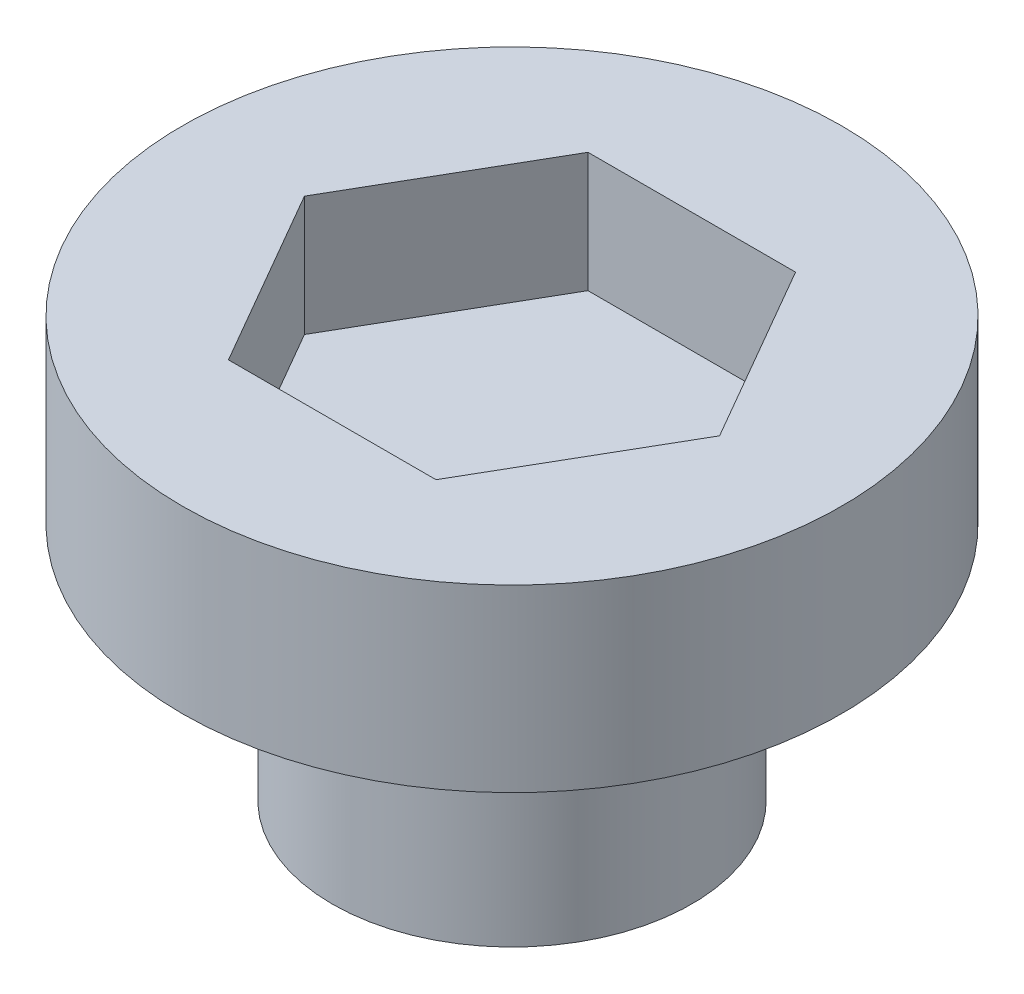
ISO-10303-21;
HEADER;
FILE_DESCRIPTION(('STEP AP214'),'2;1');
FILE_NAME('part.step','',(''),(''),'','','');
FILE_SCHEMA(('AUTOMOTIVE_DESIGN { 1 0 10303 214 1 1 1 1 }'));
ENDSEC;
DATA;
#1=APPLICATION_CONTEXT('core data for automotive mechanical design processes');
#2=APPLICATION_PROTOCOL_DEFINITION('international standard','automotive_design',2000,#1);
#3=PRODUCT_CONTEXT('',#1,'mechanical');
#4=PRODUCT('Part','Part','',(#3));
#5=PRODUCT_RELATED_PRODUCT_CATEGORY('part','',(#4));
#6=PRODUCT_DEFINITION_FORMATION('','',#4);
#7=PRODUCT_DEFINITION_CONTEXT('part definition',#1,'design');
#8=PRODUCT_DEFINITION('design','',#6,#7);
#9=PRODUCT_DEFINITION_SHAPE('','',#8);
#10=(LENGTH_UNIT() NAMED_UNIT(*) SI_UNIT(.MILLI.,.METRE.));
#11=(NAMED_UNIT(*) PLANE_ANGLE_UNIT() SI_UNIT($,.RADIAN.));
#12=(NAMED_UNIT(*) SI_UNIT($,.STERADIAN.) SOLID_ANGLE_UNIT());
#13=UNCERTAINTY_MEASURE_WITH_UNIT(LENGTH_MEASURE(1.E-05),#10,'distance_accuracy_value','');
#14=(GEOMETRIC_REPRESENTATION_CONTEXT(3) GLOBAL_UNCERTAINTY_ASSIGNED_CONTEXT((#13)) GLOBAL_UNIT_ASSIGNED_CONTEXT((#10,
#11,#12)) REPRESENTATION_CONTEXT('',''));
#15=CARTESIAN_POINT('',(0.,0.,0.));
#16=DIRECTION('',(0.,0.,1.));
#17=DIRECTION('',(1.,0.,0.));
#18=AXIS2_PLACEMENT_3D('',#15,#16,#17);
#19=CARTESIAN_POINT('',(0.,2.,0.));
#20=DIRECTION('',(0.,-1.,0.));
#21=DIRECTION('',(0.,0.,-1.));
#22=AXIS2_PLACEMENT_3D('',#19,#20,#21);
#23=PLANE('',#22);
#24=CARTESIAN_POINT('',(0.,2.,0.));
#25=DIRECTION('',(0.,-1.,0.));
#26=DIRECTION('',(0.,0.,-1.));
#27=AXIS2_PLACEMENT_3D('',#24,#25,#26);
#28=CIRCLE('',#27,2.75);
#29=CARTESIAN_POINT('',(0.,2.,-2.75));
#30=VERTEX_POINT('',#29);
#31=EDGE_CURVE('E11',#30,#30,#28,.T.);
#32=ORIENTED_EDGE('',*,*,#31,.T.);
#33=EDGE_LOOP('',(#32));
#34=FACE_BOUND('',#33,.T.);
#35=CARTESIAN_POINT('',(0.,2.,0.));
#36=DIRECTION('',(0.,-1.,0.));
#37=DIRECTION('',(0.,0.,-1.));
#38=AXIS2_PLACEMENT_3D('',#35,#36,#37);
#39=CIRCLE('',#38,1.5);
#40=CARTESIAN_POINT('',(0.,2.,-1.5));
#41=VERTEX_POINT('',#40);
#42=EDGE_CURVE('E136',#41,#41,#39,.T.);
#43=ORIENTED_EDGE('',*,*,#42,.F.);
#44=EDGE_LOOP('',(#43));
#45=FACE_BOUND('',#44,.T.);
#46=ADVANCED_FACE('F35',(#34,#45),#23,.T.);
#47=CARTESIAN_POINT('',(0.,0.,0.));
#48=DIRECTION('',(0.,-1.,0.));
#49=DIRECTION('',(0.,0.,-1.));
#50=AXIS2_PLACEMENT_3D('',#47,#48,#49);
#51=CYLINDRICAL_SURFACE('',#50,2.75);
#52=CARTESIAN_POINT('',(0.,3.5,0.));
#53=DIRECTION('',(0.,-1.,0.));
#54=DIRECTION('',(0.,0.,-1.));
#55=AXIS2_PLACEMENT_3D('',#52,#53,#54);
#56=CIRCLE('',#55,2.75);
#57=CARTESIAN_POINT('',(0.,3.5,-2.75));
#58=VERTEX_POINT('',#57);
#59=EDGE_CURVE('E42',#58,#58,#56,.T.);
#60=ORIENTED_EDGE('',*,*,#59,.T.);
#61=EDGE_LOOP('',(#60));
#62=FACE_BOUND('',#61,.T.);
#63=ORIENTED_EDGE('',*,*,#31,.F.);
#64=EDGE_LOOP('',(#63));
#65=FACE_BOUND('',#64,.T.);
#66=ADVANCED_FACE('F149',(#62,#65),#51,.T.);
#67=CARTESIAN_POINT('',(0.,3.5,0.));
#68=DIRECTION('',(0.,-1.,0.));
#69=DIRECTION('',(0.,0.,-1.));
#70=AXIS2_PLACEMENT_3D('',#67,#68,#69);
#71=PLANE('',#70);
#72=DIRECTION('',(-0.5,0.,0.866025403784439));
#73=VECTOR('',#72,1.);
#74=CARTESIAN_POINT('',(-0.866025403784438,3.5,-1.5));
#75=LINE('',#74,#73);
#76=CARTESIAN_POINT('',(-0.866025403784438,3.5,-1.5));
#77=VERTEX_POINT('',#76);
#78=CARTESIAN_POINT('',(-1.73205080756888,3.5,0.));
#79=VERTEX_POINT('',#78);
#80=EDGE_CURVE('E123',#77,#79,#75,.T.);
#81=ORIENTED_EDGE('',*,*,#80,.F.);
#82=DIRECTION('',(-1.,0.,0.));
#83=VECTOR('',#82,1.);
#84=CARTESIAN_POINT('',(0.86602540378444,3.5,-1.5));
#85=LINE('',#84,#83);
#86=CARTESIAN_POINT('',(0.86602540378444,3.5,-1.5));
#87=VERTEX_POINT('',#86);
#88=EDGE_CURVE('E49',#87,#77,#85,.T.);
#89=ORIENTED_EDGE('',*,*,#88,.F.);
#90=DIRECTION('',(-0.5,0.,-0.866025403784439));
#91=VECTOR('',#90,1.);
#92=CARTESIAN_POINT('',(1.73205080756888,3.5,0.));
#93=LINE('',#92,#91);
#94=CARTESIAN_POINT('',(1.73205080756888,3.5,0.));
#95=VERTEX_POINT('',#94);
#96=EDGE_CURVE('E132',#95,#87,#93,.T.);
#97=ORIENTED_EDGE('',*,*,#96,.F.);
#98=DIRECTION('',(0.5,0.,-0.866025403784439));
#99=VECTOR('',#98,1.);
#100=CARTESIAN_POINT('',(0.866025403784438,3.5,1.5));
#101=LINE('',#100,#99);
#102=CARTESIAN_POINT('',(0.866025403784438,3.5,1.5));
#103=VERTEX_POINT('',#102);
#104=EDGE_CURVE('E130',#103,#95,#101,.T.);
#105=ORIENTED_EDGE('',*,*,#104,.F.);
#106=DIRECTION('',(1.,0.,0.));
#107=VECTOR('',#106,1.);
#108=CARTESIAN_POINT('',(-0.866025403784439,3.5,1.5));
#109=LINE('',#108,#107);
#110=CARTESIAN_POINT('',(-0.866025403784439,3.5,1.5));
#111=VERTEX_POINT('',#110);
#112=EDGE_CURVE('E97',#111,#103,#109,.T.);
#113=ORIENTED_EDGE('',*,*,#112,.F.);
#114=DIRECTION('',(0.5,0.,0.866025403784439));
#115=VECTOR('',#114,1.);
#116=CARTESIAN_POINT('',(-1.73205080756888,3.5,0.));
#117=LINE('',#116,#115);
#118=EDGE_CURVE('E126',#79,#111,#117,.T.);
#119=ORIENTED_EDGE('',*,*,#118,.F.);
#120=EDGE_LOOP('',(#81,#89,#97,#105,#113,#119));
#121=FACE_BOUND('',#120,.T.);
#122=ORIENTED_EDGE('',*,*,#59,.F.);
#123=EDGE_LOOP('',(#122));
#124=FACE_BOUND('',#123,.T.);
#125=ADVANCED_FACE('F152',(#121,#124),#71,.F.);
#126=CARTESIAN_POINT('',(0.,0.,0.));
#127=DIRECTION('',(0.,-1.,0.));
#128=DIRECTION('',(0.,0.,-1.));
#129=AXIS2_PLACEMENT_3D('',#126,#127,#128);
#130=PLANE('',#129);
#131=CARTESIAN_POINT('',(0.,0.,0.));
#132=DIRECTION('',(0.,-1.,0.));
#133=DIRECTION('',(0.,0.,-1.));
#134=AXIS2_PLACEMENT_3D('',#131,#132,#133);
#135=CIRCLE('',#134,1.5);
#136=CARTESIAN_POINT('',(0.,0.,-1.5));
#137=VERTEX_POINT('',#136);
#138=EDGE_CURVE('E144',#137,#137,#135,.T.);
#139=ORIENTED_EDGE('',*,*,#138,.T.);
#140=EDGE_LOOP('',(#139));
#141=FACE_BOUND('',#140,.T.);
#142=ADVANCED_FACE('F154',(#141),#130,.T.);
#143=CARTESIAN_POINT('',(0.,0.,0.));
#144=DIRECTION('',(0.,-1.,0.));
#145=DIRECTION('',(0.,0.,-1.));
#146=AXIS2_PLACEMENT_3D('',#143,#144,#145);
#147=CYLINDRICAL_SURFACE('',#146,1.5);
#148=ORIENTED_EDGE('',*,*,#42,.T.);
#149=EDGE_LOOP('',(#148));
#150=FACE_BOUND('',#149,.T.);
#151=ORIENTED_EDGE('',*,*,#138,.F.);
#152=EDGE_LOOP('',(#151));
#153=FACE_BOUND('',#152,.T.);
#154=ADVANCED_FACE('F161',(#150,#153),#147,.T.);
#155=CARTESIAN_POINT('',(0.86602540378444,2.5,-1.5));
#156=DIRECTION('',(0.,0.,-1.));
#157=DIRECTION('',(-1.,0.,0.));
#158=AXIS2_PLACEMENT_3D('',#155,#156,#157);
#159=PLANE('',#158);
#160=ORIENTED_EDGE('',*,*,#88,.T.);
#161=DIRECTION('',(0.,1.,0.));
#162=VECTOR('',#161,1.);
#163=CARTESIAN_POINT('',(-0.866025403784438,2.5,-1.5));
#164=LINE('',#163,#162);
#165=CARTESIAN_POINT('',(-0.866025403784438,2.5,-1.5));
#166=VERTEX_POINT('',#165);
#167=EDGE_CURVE('E79',#166,#77,#164,.T.);
#168=ORIENTED_EDGE('',*,*,#167,.F.);
#169=DIRECTION('',(-1.,0.,0.));
#170=VECTOR('',#169,1.);
#171=CARTESIAN_POINT('',(0.86602540378444,2.5,-1.5));
#172=LINE('',#171,#170);
#173=CARTESIAN_POINT('',(0.86602540378444,2.5,-1.5));
#174=VERTEX_POINT('',#173);
#175=EDGE_CURVE('E134',#174,#166,#172,.T.);
#176=ORIENTED_EDGE('',*,*,#175,.F.);
#177=DIRECTION('',(0.,1.,0.));
#178=VECTOR('',#177,1.);
#179=CARTESIAN_POINT('',(0.86602540378444,2.5,-1.5));
#180=LINE('',#179,#178);
#181=EDGE_CURVE('E57',#174,#87,#180,.T.);
#182=ORIENTED_EDGE('',*,*,#181,.T.);
#183=EDGE_LOOP('',(#160,#168,#176,#182));
#184=FACE_BOUND('',#183,.T.);
#185=ADVANCED_FACE('F175',(#184),#159,.F.);
#186=CARTESIAN_POINT('',(1.73205080756888,2.5,0.));
#187=DIRECTION('',(0.866025403784439,0.,-0.5));
#188=DIRECTION('',(-0.5,0.,-0.866025403784439));
#189=AXIS2_PLACEMENT_3D('',#186,#187,#188);
#190=PLANE('',#189);
#191=ORIENTED_EDGE('',*,*,#96,.T.);
#192=ORIENTED_EDGE('',*,*,#181,.F.);
#193=DIRECTION('',(-0.5,0.,-0.866025403784439));
#194=VECTOR('',#193,1.);
#195=CARTESIAN_POINT('',(1.73205080756888,2.5,0.));
#196=LINE('',#195,#194);
#197=CARTESIAN_POINT('',(1.73205080756888,2.5,0.));
#198=VERTEX_POINT('',#197);
#199=EDGE_CURVE('E109',#198,#174,#196,.T.);
#200=ORIENTED_EDGE('',*,*,#199,.F.);
#201=DIRECTION('',(0.,1.,0.));
#202=VECTOR('',#201,1.);
#203=CARTESIAN_POINT('',(1.73205080756888,2.5,0.));
#204=LINE('',#203,#202);
#205=EDGE_CURVE('E101',#198,#95,#204,.T.);
#206=ORIENTED_EDGE('',*,*,#205,.T.);
#207=EDGE_LOOP('',(#191,#192,#200,#206));
#208=FACE_BOUND('',#207,.T.);
#209=ADVANCED_FACE('F181',(#208),#190,.F.);
#210=CARTESIAN_POINT('',(0.866025403784438,2.5,1.5));
#211=DIRECTION('',(0.866025403784439,0.,0.5));
#212=DIRECTION('',(0.5,0.,-0.866025403784439));
#213=AXIS2_PLACEMENT_3D('',#210,#211,#212);
#214=PLANE('',#213);
#215=ORIENTED_EDGE('',*,*,#104,.T.);
#216=ORIENTED_EDGE('',*,*,#205,.F.);
#217=DIRECTION('',(0.5,0.,-0.866025403784439));
#218=VECTOR('',#217,1.);
#219=CARTESIAN_POINT('',(0.866025403784438,2.5,1.5));
#220=LINE('',#219,#218);
#221=CARTESIAN_POINT('',(0.866025403784438,2.5,1.5));
#222=VERTEX_POINT('',#221);
#223=EDGE_CURVE('E105',#222,#198,#220,.T.);
#224=ORIENTED_EDGE('',*,*,#223,.F.);
#225=DIRECTION('',(0.,1.,0.));
#226=VECTOR('',#225,1.);
#227=CARTESIAN_POINT('',(0.866025403784438,2.5,1.5));
#228=LINE('',#227,#226);
#229=EDGE_CURVE('E90',#222,#103,#228,.T.);
#230=ORIENTED_EDGE('',*,*,#229,.T.);
#231=EDGE_LOOP('',(#215,#216,#224,#230));
#232=FACE_BOUND('',#231,.T.);
#233=ADVANCED_FACE('F106',(#232),#214,.F.);
#234=CARTESIAN_POINT('',(-0.866025403784439,2.5,1.5));
#235=DIRECTION('',(0.,0.,1.));
#236=DIRECTION('',(1.,0.,0.));
#237=AXIS2_PLACEMENT_3D('',#234,#235,#236);
#238=PLANE('',#237);
#239=ORIENTED_EDGE('',*,*,#112,.T.);
#240=ORIENTED_EDGE('',*,*,#229,.F.);
#241=DIRECTION('',(1.,0.,0.));
#242=VECTOR('',#241,1.);
#243=CARTESIAN_POINT('',(-0.866025403784439,2.5,1.5));
#244=LINE('',#243,#242);
#245=CARTESIAN_POINT('',(-0.866025403784439,2.5,1.5));
#246=VERTEX_POINT('',#245);
#247=EDGE_CURVE('E94',#246,#222,#244,.T.);
#248=ORIENTED_EDGE('',*,*,#247,.F.);
#249=DIRECTION('',(0.,1.,0.));
#250=VECTOR('',#249,1.);
#251=CARTESIAN_POINT('',(-0.866025403784439,2.5,1.5));
#252=LINE('',#251,#250);
#253=EDGE_CURVE('E102',#246,#111,#252,.T.);
#254=ORIENTED_EDGE('',*,*,#253,.T.);
#255=EDGE_LOOP('',(#239,#240,#248,#254));
#256=FACE_BOUND('',#255,.T.);
#257=ADVANCED_FACE('F92',(#256),#238,.F.);
#258=CARTESIAN_POINT('',(-1.73205080756888,2.5,0.));
#259=DIRECTION('',(-0.866025403784439,0.,0.5));
#260=DIRECTION('',(0.5,0.,0.866025403784439));
#261=AXIS2_PLACEMENT_3D('',#258,#259,#260);
#262=PLANE('',#261);
#263=ORIENTED_EDGE('',*,*,#118,.T.);
#264=ORIENTED_EDGE('',*,*,#253,.F.);
#265=DIRECTION('',(0.5,0.,0.866025403784439));
#266=VECTOR('',#265,1.);
#267=CARTESIAN_POINT('',(-1.73205080756888,2.5,0.));
#268=LINE('',#267,#266);
#269=CARTESIAN_POINT('',(-1.73205080756888,2.5,0.));
#270=VERTEX_POINT('',#269);
#271=EDGE_CURVE('E115',#270,#246,#268,.T.);
#272=ORIENTED_EDGE('',*,*,#271,.F.);
#273=DIRECTION('',(0.,1.,0.));
#274=VECTOR('',#273,1.);
#275=CARTESIAN_POINT('',(-1.73205080756888,2.5,0.));
#276=LINE('',#275,#274);
#277=EDGE_CURVE('E139',#270,#79,#276,.T.);
#278=ORIENTED_EDGE('',*,*,#277,.T.);
#279=EDGE_LOOP('',(#263,#264,#272,#278));
#280=FACE_BOUND('',#279,.T.);
#281=ADVANCED_FACE('F187',(#280),#262,.F.);
#282=CARTESIAN_POINT('',(-0.866025403784438,2.5,-1.5));
#283=DIRECTION('',(-0.866025403784439,0.,-0.5));
#284=DIRECTION('',(-0.5,0.,0.866025403784439));
#285=AXIS2_PLACEMENT_3D('',#282,#283,#284);
#286=PLANE('',#285);
#287=ORIENTED_EDGE('',*,*,#80,.T.);
#288=ORIENTED_EDGE('',*,*,#277,.F.);
#289=DIRECTION('',(-0.5,0.,0.866025403784439));
#290=VECTOR('',#289,1.);
#291=CARTESIAN_POINT('',(-0.866025403784438,2.5,-1.5));
#292=LINE('',#291,#290);
#293=EDGE_CURVE('E117',#166,#270,#292,.T.);
#294=ORIENTED_EDGE('',*,*,#293,.F.);
#295=ORIENTED_EDGE('',*,*,#167,.T.);
#296=EDGE_LOOP('',(#287,#288,#294,#295));
#297=FACE_BOUND('',#296,.T.);
#298=ADVANCED_FACE('F184',(#297),#286,.F.);
#299=CARTESIAN_POINT('',(0.,2.5,0.));
#300=DIRECTION('',(0.,1.,0.));
#301=DIRECTION('',(0.,0.,1.));
#302=AXIS2_PLACEMENT_3D('',#299,#300,#301);
#303=PLANE('',#302);
#304=ORIENTED_EDGE('',*,*,#175,.T.);
#305=ORIENTED_EDGE('',*,*,#293,.T.);
#306=ORIENTED_EDGE('',*,*,#271,.T.);
#307=ORIENTED_EDGE('',*,*,#247,.T.);
#308=ORIENTED_EDGE('',*,*,#223,.T.);
#309=ORIENTED_EDGE('',*,*,#199,.T.);
#310=EDGE_LOOP('',(#304,#305,#306,#307,#308,#309));
#311=FACE_BOUND('',#310,.T.);
#312=ADVANCED_FACE('F112',(#311),#303,.T.);
#313=CLOSED_SHELL('',(#46,#66,#125,#142,#154,#185,#209,#233,#257,#281,#298,#312));
#314=MANIFOLD_SOLID_BREP('B2',#313);
#315=ADVANCED_BREP_SHAPE_REPRESENTATION('',(#18,#314),#14);
#316=SHAPE_DEFINITION_REPRESENTATION(#9,#315);
ENDSEC;
END-ISO-10303-21;
